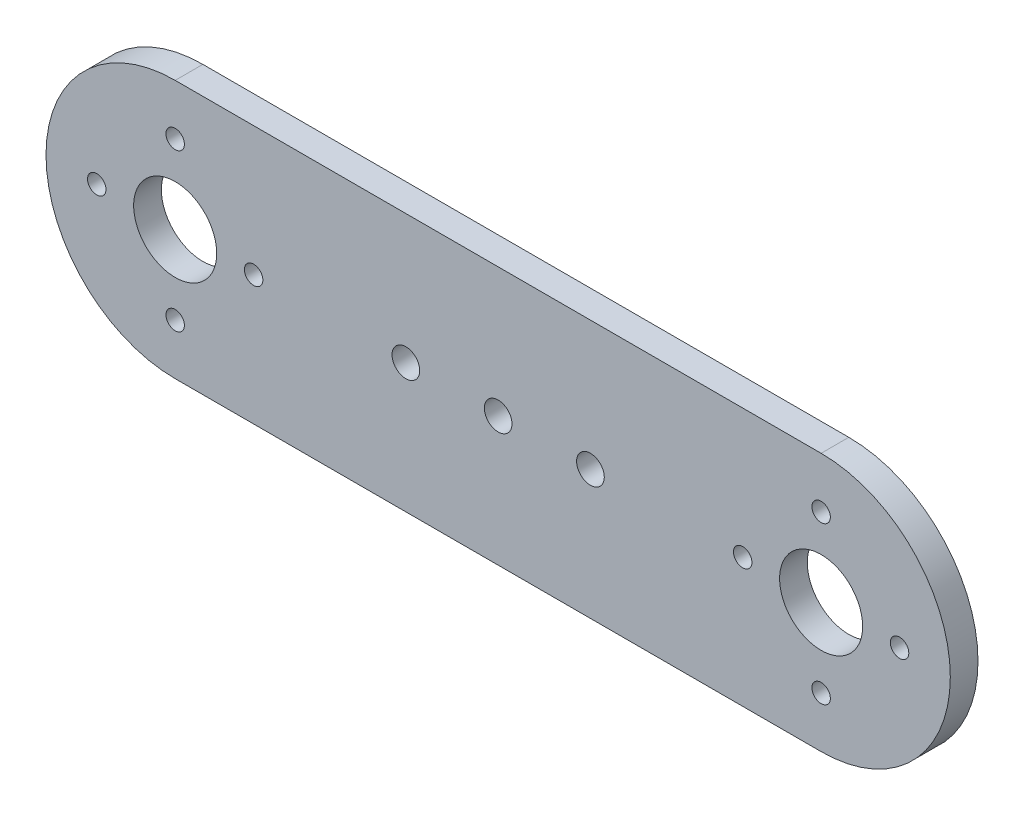
ISO-10303-21;
HEADER;
FILE_DESCRIPTION(('STEP AP214'),'2;1');
FILE_NAME('part.step','',(''),(''),'','','');
FILE_SCHEMA(('AUTOMOTIVE_DESIGN { 1 0 10303 214 1 1 1 1 }'));
ENDSEC;
DATA;
#1=APPLICATION_CONTEXT('core data for automotive mechanical design processes');
#2=APPLICATION_PROTOCOL_DEFINITION('international standard','automotive_design',2000,#1);
#3=PRODUCT_CONTEXT('',#1,'mechanical');
#4=PRODUCT('Part','Part','',(#3));
#5=PRODUCT_RELATED_PRODUCT_CATEGORY('part','',(#4));
#6=PRODUCT_DEFINITION_FORMATION('','',#4);
#7=PRODUCT_DEFINITION_CONTEXT('part definition',#1,'design');
#8=PRODUCT_DEFINITION('design','',#6,#7);
#9=PRODUCT_DEFINITION_SHAPE('','',#8);
#10=(LENGTH_UNIT() NAMED_UNIT(*) SI_UNIT(.MILLI.,.METRE.));
#11=(NAMED_UNIT(*) PLANE_ANGLE_UNIT() SI_UNIT($,.RADIAN.));
#12=(NAMED_UNIT(*) SI_UNIT($,.STERADIAN.) SOLID_ANGLE_UNIT());
#13=UNCERTAINTY_MEASURE_WITH_UNIT(LENGTH_MEASURE(1.E-05),#10,'distance_accuracy_value','');
#14=(GEOMETRIC_REPRESENTATION_CONTEXT(3) GLOBAL_UNCERTAINTY_ASSIGNED_CONTEXT((#13)) GLOBAL_UNIT_ASSIGNED_CONTEXT((#10,
#11,#12)) REPRESENTATION_CONTEXT('',''));
#15=CARTESIAN_POINT('',(0.,0.,0.));
#16=DIRECTION('',(0.,0.,1.));
#17=DIRECTION('',(1.,0.,0.));
#18=AXIS2_PLACEMENT_3D('',#15,#16,#17);
#19=CARTESIAN_POINT('',(0.,0.,3.));
#20=DIRECTION('',(0.,0.,1.));
#21=DIRECTION('',(1.,0.,0.));
#22=AXIS2_PLACEMENT_3D('',#19,#20,#21);
#23=PLANE('',#22);
#24=CARTESIAN_POINT('',(34.9999999999983,0.,3.));
#25=DIRECTION('',(0.,0.,1.));
#26=DIRECTION('',(1.,0.,0.));
#27=AXIS2_PLACEMENT_3D('',#24,#25,#26);
#28=CIRCLE('',#27,1.5);
#29=CARTESIAN_POINT('',(36.4999999999983,0.,3.));
#30=VERTEX_POINT('',#29);
#31=EDGE_CURVE('E180',#30,#30,#28,.T.);
#32=ORIENTED_EDGE('',*,*,#31,.F.);
#33=EDGE_LOOP('',(#32));
#34=FACE_BOUND('',#33,.T.);
#35=CARTESIAN_POINT('',(61.5,0.,3.));
#36=DIRECTION('',(0.,0.,1.));
#37=DIRECTION('',(1.,0.,0.));
#38=AXIS2_PLACEMENT_3D('',#35,#36,#37);
#39=CIRCLE('',#38,0.999999999999998);
#40=CARTESIAN_POINT('',(62.5,0.,3.));
#41=VERTEX_POINT('',#40);
#42=EDGE_CURVE('E168',#41,#41,#39,.T.);
#43=ORIENTED_EDGE('',*,*,#42,.F.);
#44=EDGE_LOOP('',(#43));
#45=FACE_BOUND('',#44,.T.);
#46=CARTESIAN_POINT('',(78.5,0.,3.));
#47=DIRECTION('',(0.,0.,1.));
#48=DIRECTION('',(1.,0.,0.));
#49=AXIS2_PLACEMENT_3D('',#46,#47,#48);
#50=CIRCLE('',#49,0.999999999999998);
#51=CARTESIAN_POINT('',(79.5,0.,3.));
#52=VERTEX_POINT('',#51);
#53=EDGE_CURVE('E156',#52,#52,#50,.T.);
#54=ORIENTED_EDGE('',*,*,#53,.F.);
#55=EDGE_LOOP('',(#54));
#56=FACE_BOUND('',#55,.T.);
#57=CARTESIAN_POINT('',(70.,0.,3.));
#58=DIRECTION('',(0.,0.,1.));
#59=DIRECTION('',(1.,0.,0.));
#60=AXIS2_PLACEMENT_3D('',#57,#58,#59);
#61=CIRCLE('',#60,4.5);
#62=CARTESIAN_POINT('',(74.5,0.,3.));
#63=VERTEX_POINT('',#62);
#64=EDGE_CURVE('E144',#63,#63,#61,.T.);
#65=ORIENTED_EDGE('',*,*,#64,.F.);
#66=EDGE_LOOP('',(#65));
#67=FACE_BOUND('',#66,.T.);
#68=CARTESIAN_POINT('',(0.,-8.5,3.));
#69=DIRECTION('',(0.,0.,1.));
#70=DIRECTION('',(1.,0.,0.));
#71=AXIS2_PLACEMENT_3D('',#68,#69,#70);
#72=CIRCLE('',#71,1.);
#73=CARTESIAN_POINT('',(1.,-8.5,3.));
#74=VERTEX_POINT('',#73);
#75=EDGE_CURVE('E132',#74,#74,#72,.T.);
#76=ORIENTED_EDGE('',*,*,#75,.F.);
#77=EDGE_LOOP('',(#76));
#78=FACE_BOUND('',#77,.T.);
#79=CARTESIAN_POINT('',(0.,8.5,3.));
#80=DIRECTION('',(0.,0.,1.));
#81=DIRECTION('',(1.,0.,0.));
#82=AXIS2_PLACEMENT_3D('',#79,#80,#81);
#83=CIRCLE('',#82,1.);
#84=CARTESIAN_POINT('',(1.,8.5,3.));
#85=VERTEX_POINT('',#84);
#86=EDGE_CURVE('E120',#85,#85,#83,.T.);
#87=ORIENTED_EDGE('',*,*,#86,.F.);
#88=EDGE_LOOP('',(#87));
#89=FACE_BOUND('',#88,.T.);
#90=CARTESIAN_POINT('',(0.,0.,3.));
#91=DIRECTION('',(0.,0.,1.));
#92=DIRECTION('',(1.,0.,0.));
#93=AXIS2_PLACEMENT_3D('',#90,#91,#92);
#94=CIRCLE('',#93,14.);
#95=CARTESIAN_POINT('',(0.,14.,3.));
#96=VERTEX_POINT('',#95);
#97=CARTESIAN_POINT('',(0.,-14.,3.));
#98=VERTEX_POINT('',#97);
#99=EDGE_CURVE('E90',#96,#98,#94,.T.);
#100=ORIENTED_EDGE('',*,*,#99,.T.);
#101=DIRECTION('',(1.,0.,0.));
#102=VECTOR('',#101,1.);
#103=CARTESIAN_POINT('',(0.,-14.,3.));
#104=LINE('',#103,#102);
#105=CARTESIAN_POINT('',(70.,-14.,3.));
#106=VERTEX_POINT('',#105);
#107=EDGE_CURVE('E85',#98,#106,#104,.T.);
#108=ORIENTED_EDGE('',*,*,#107,.T.);
#109=CARTESIAN_POINT('',(70.,0.,3.));
#110=DIRECTION('',(0.,0.,1.));
#111=DIRECTION('',(1.,0.,0.));
#112=AXIS2_PLACEMENT_3D('',#109,#110,#111);
#113=CIRCLE('',#112,14.);
#114=CARTESIAN_POINT('',(70.,14.,3.));
#115=VERTEX_POINT('',#114);
#116=EDGE_CURVE('E88',#106,#115,#113,.T.);
#117=ORIENTED_EDGE('',*,*,#116,.T.);
#118=DIRECTION('',(-1.,0.,0.));
#119=VECTOR('',#118,1.);
#120=CARTESIAN_POINT('',(0.,14.,3.));
#121=LINE('',#120,#119);
#122=EDGE_CURVE('E55',#115,#96,#121,.T.);
#123=ORIENTED_EDGE('',*,*,#122,.T.);
#124=EDGE_LOOP('',(#100,#108,#117,#123));
#125=FACE_BOUND('',#124,.T.);
#126=CARTESIAN_POINT('',(0.,0.,3.));
#127=DIRECTION('',(0.,0.,1.));
#128=DIRECTION('',(1.,0.,0.));
#129=AXIS2_PLACEMENT_3D('',#126,#127,#128);
#130=CIRCLE('',#129,4.5);
#131=CARTESIAN_POINT('',(4.5,0.,3.));
#132=VERTEX_POINT('',#131);
#133=EDGE_CURVE('E105',#132,#132,#130,.T.);
#134=ORIENTED_EDGE('',*,*,#133,.F.);
#135=EDGE_LOOP('',(#134));
#136=FACE_BOUND('',#135,.T.);
#137=CARTESIAN_POINT('',(8.5,0.,3.));
#138=DIRECTION('',(0.,0.,1.));
#139=DIRECTION('',(1.,0.,0.));
#140=AXIS2_PLACEMENT_3D('',#137,#138,#139);
#141=CIRCLE('',#140,1.);
#142=CARTESIAN_POINT('',(9.5,0.,3.));
#143=VERTEX_POINT('',#142);
#144=EDGE_CURVE('E126',#143,#143,#141,.T.);
#145=ORIENTED_EDGE('',*,*,#144,.F.);
#146=EDGE_LOOP('',(#145));
#147=FACE_BOUND('',#146,.T.);
#148=CARTESIAN_POINT('',(-8.5,0.,3.));
#149=DIRECTION('',(0.,0.,1.));
#150=DIRECTION('',(1.,0.,0.));
#151=AXIS2_PLACEMENT_3D('',#148,#149,#150);
#152=CIRCLE('',#151,1.);
#153=CARTESIAN_POINT('',(-7.5,0.,3.));
#154=VERTEX_POINT('',#153);
#155=EDGE_CURVE('E138',#154,#154,#152,.T.);
#156=ORIENTED_EDGE('',*,*,#155,.F.);
#157=EDGE_LOOP('',(#156));
#158=FACE_BOUND('',#157,.T.);
#159=CARTESIAN_POINT('',(70.,8.5,3.));
#160=DIRECTION('',(0.,0.,1.));
#161=DIRECTION('',(1.,0.,0.));
#162=AXIS2_PLACEMENT_3D('',#159,#160,#161);
#163=CIRCLE('',#162,0.999999999999998);
#164=CARTESIAN_POINT('',(71.,8.5,3.));
#165=VERTEX_POINT('',#164);
#166=EDGE_CURVE('E150',#165,#165,#163,.T.);
#167=ORIENTED_EDGE('',*,*,#166,.F.);
#168=EDGE_LOOP('',(#167));
#169=FACE_BOUND('',#168,.T.);
#170=CARTESIAN_POINT('',(70.,-8.5,3.));
#171=DIRECTION('',(0.,0.,1.));
#172=DIRECTION('',(1.,0.,0.));
#173=AXIS2_PLACEMENT_3D('',#170,#171,#172);
#174=CIRCLE('',#173,0.999999999999998);
#175=CARTESIAN_POINT('',(71.,-8.5,3.));
#176=VERTEX_POINT('',#175);
#177=EDGE_CURVE('E162',#176,#176,#174,.T.);
#178=ORIENTED_EDGE('',*,*,#177,.F.);
#179=EDGE_LOOP('',(#178));
#180=FACE_BOUND('',#179,.T.);
#181=CARTESIAN_POINT('',(25.0000000000028,0.,3.));
#182=DIRECTION('',(0.,0.,1.));
#183=DIRECTION('',(1.,0.,0.));
#184=AXIS2_PLACEMENT_3D('',#181,#182,#183);
#185=CIRCLE('',#184,1.5);
#186=CARTESIAN_POINT('',(26.5000000000028,0.,3.));
#187=VERTEX_POINT('',#186);
#188=EDGE_CURVE('E174',#187,#187,#185,.T.);
#189=ORIENTED_EDGE('',*,*,#188,.F.);
#190=EDGE_LOOP('',(#189));
#191=FACE_BOUND('',#190,.T.);
#192=CARTESIAN_POINT('',(44.9999999999938,0.,3.));
#193=DIRECTION('',(0.,0.,1.));
#194=DIRECTION('',(1.,0.,0.));
#195=AXIS2_PLACEMENT_3D('',#192,#193,#194);
#196=CIRCLE('',#195,1.5);
#197=CARTESIAN_POINT('',(46.4999999999938,0.,3.));
#198=VERTEX_POINT('',#197);
#199=EDGE_CURVE('E186',#198,#198,#196,.T.);
#200=ORIENTED_EDGE('',*,*,#199,.F.);
#201=EDGE_LOOP('',(#200));
#202=FACE_BOUND('',#201,.T.);
#203=ADVANCED_FACE('F38',(#34,#45,#56,#67,#78,#89,#125,#136,#147,#158,#169,#180,#191,#202),#23,.T.);
#204=CARTESIAN_POINT('',(0.,0.,0.));
#205=DIRECTION('',(0.,0.,1.));
#206=DIRECTION('',(1.,0.,0.));
#207=AXIS2_PLACEMENT_3D('',#204,#205,#206);
#208=PLANE('',#207);
#209=CARTESIAN_POINT('',(34.9999999999983,0.,0.));
#210=DIRECTION('',(0.,0.,1.));
#211=DIRECTION('',(1.,0.,0.));
#212=AXIS2_PLACEMENT_3D('',#209,#210,#211);
#213=CIRCLE('',#212,1.5);
#214=CARTESIAN_POINT('',(36.4999999999983,0.,0.));
#215=VERTEX_POINT('',#214);
#216=EDGE_CURVE('E183',#215,#215,#213,.T.);
#217=ORIENTED_EDGE('',*,*,#216,.T.);
#218=EDGE_LOOP('',(#217));
#219=FACE_BOUND('',#218,.T.);
#220=CARTESIAN_POINT('',(61.5,0.,0.));
#221=DIRECTION('',(0.,0.,1.));
#222=DIRECTION('',(1.,0.,0.));
#223=AXIS2_PLACEMENT_3D('',#220,#221,#222);
#224=CIRCLE('',#223,0.999999999999998);
#225=CARTESIAN_POINT('',(62.5,0.,0.));
#226=VERTEX_POINT('',#225);
#227=EDGE_CURVE('E171',#226,#226,#224,.T.);
#228=ORIENTED_EDGE('',*,*,#227,.T.);
#229=EDGE_LOOP('',(#228));
#230=FACE_BOUND('',#229,.T.);
#231=CARTESIAN_POINT('',(78.5,0.,0.));
#232=DIRECTION('',(0.,0.,1.));
#233=DIRECTION('',(1.,0.,0.));
#234=AXIS2_PLACEMENT_3D('',#231,#232,#233);
#235=CIRCLE('',#234,0.999999999999998);
#236=CARTESIAN_POINT('',(79.5,0.,0.));
#237=VERTEX_POINT('',#236);
#238=EDGE_CURVE('E159',#237,#237,#235,.T.);
#239=ORIENTED_EDGE('',*,*,#238,.T.);
#240=EDGE_LOOP('',(#239));
#241=FACE_BOUND('',#240,.T.);
#242=CARTESIAN_POINT('',(70.,0.,0.));
#243=DIRECTION('',(0.,0.,1.));
#244=DIRECTION('',(1.,0.,0.));
#245=AXIS2_PLACEMENT_3D('',#242,#243,#244);
#246=CIRCLE('',#245,4.5);
#247=CARTESIAN_POINT('',(74.5,0.,0.));
#248=VERTEX_POINT('',#247);
#249=EDGE_CURVE('E147',#248,#248,#246,.T.);
#250=ORIENTED_EDGE('',*,*,#249,.T.);
#251=EDGE_LOOP('',(#250));
#252=FACE_BOUND('',#251,.T.);
#253=CARTESIAN_POINT('',(0.,-8.5,0.));
#254=DIRECTION('',(0.,0.,1.));
#255=DIRECTION('',(1.,0.,0.));
#256=AXIS2_PLACEMENT_3D('',#253,#254,#255);
#257=CIRCLE('',#256,1.);
#258=CARTESIAN_POINT('',(1.,-8.5,0.));
#259=VERTEX_POINT('',#258);
#260=EDGE_CURVE('E135',#259,#259,#257,.T.);
#261=ORIENTED_EDGE('',*,*,#260,.T.);
#262=EDGE_LOOP('',(#261));
#263=FACE_BOUND('',#262,.T.);
#264=CARTESIAN_POINT('',(0.,8.5,0.));
#265=DIRECTION('',(0.,0.,1.));
#266=DIRECTION('',(1.,0.,0.));
#267=AXIS2_PLACEMENT_3D('',#264,#265,#266);
#268=CIRCLE('',#267,1.);
#269=CARTESIAN_POINT('',(1.,8.5,0.));
#270=VERTEX_POINT('',#269);
#271=EDGE_CURVE('E123',#270,#270,#268,.T.);
#272=ORIENTED_EDGE('',*,*,#271,.T.);
#273=EDGE_LOOP('',(#272));
#274=FACE_BOUND('',#273,.T.);
#275=CARTESIAN_POINT('',(0.,0.,0.));
#276=DIRECTION('',(0.,0.,1.));
#277=DIRECTION('',(1.,0.,0.));
#278=AXIS2_PLACEMENT_3D('',#275,#276,#277);
#279=CIRCLE('',#278,14.);
#280=CARTESIAN_POINT('',(0.,14.,0.));
#281=VERTEX_POINT('',#280);
#282=CARTESIAN_POINT('',(0.,-14.,0.));
#283=VERTEX_POINT('',#282);
#284=EDGE_CURVE('E102',#281,#283,#279,.T.);
#285=ORIENTED_EDGE('',*,*,#284,.F.);
#286=DIRECTION('',(-1.,0.,0.));
#287=VECTOR('',#286,1.);
#288=CARTESIAN_POINT('',(0.,14.,0.));
#289=LINE('',#288,#287);
#290=CARTESIAN_POINT('',(70.,14.,0.));
#291=VERTEX_POINT('',#290);
#292=EDGE_CURVE('E78',#291,#281,#289,.T.);
#293=ORIENTED_EDGE('',*,*,#292,.F.);
#294=CARTESIAN_POINT('',(70.,0.,0.));
#295=DIRECTION('',(0.,0.,1.));
#296=DIRECTION('',(1.,0.,0.));
#297=AXIS2_PLACEMENT_3D('',#294,#295,#296);
#298=CIRCLE('',#297,14.);
#299=CARTESIAN_POINT('',(70.,-14.,0.));
#300=VERTEX_POINT('',#299);
#301=EDGE_CURVE('E72',#300,#291,#298,.T.);
#302=ORIENTED_EDGE('',*,*,#301,.F.);
#303=DIRECTION('',(1.,0.,0.));
#304=VECTOR('',#303,1.);
#305=CARTESIAN_POINT('',(0.,-14.,0.));
#306=LINE('',#305,#304);
#307=EDGE_CURVE('E94',#283,#300,#306,.T.);
#308=ORIENTED_EDGE('',*,*,#307,.F.);
#309=EDGE_LOOP('',(#285,#293,#302,#308));
#310=FACE_BOUND('',#309,.T.);
#311=CARTESIAN_POINT('',(0.,0.,0.));
#312=DIRECTION('',(0.,0.,1.));
#313=DIRECTION('',(1.,0.,0.));
#314=AXIS2_PLACEMENT_3D('',#311,#312,#313);
#315=CIRCLE('',#314,4.5);
#316=CARTESIAN_POINT('',(4.5,0.,0.));
#317=VERTEX_POINT('',#316);
#318=EDGE_CURVE('E117',#317,#317,#315,.T.);
#319=ORIENTED_EDGE('',*,*,#318,.T.);
#320=EDGE_LOOP('',(#319));
#321=FACE_BOUND('',#320,.T.);
#322=CARTESIAN_POINT('',(8.5,0.,0.));
#323=DIRECTION('',(0.,0.,1.));
#324=DIRECTION('',(1.,0.,0.));
#325=AXIS2_PLACEMENT_3D('',#322,#323,#324);
#326=CIRCLE('',#325,1.);
#327=CARTESIAN_POINT('',(9.5,0.,0.));
#328=VERTEX_POINT('',#327);
#329=EDGE_CURVE('E129',#328,#328,#326,.T.);
#330=ORIENTED_EDGE('',*,*,#329,.T.);
#331=EDGE_LOOP('',(#330));
#332=FACE_BOUND('',#331,.T.);
#333=CARTESIAN_POINT('',(-8.5,0.,0.));
#334=DIRECTION('',(0.,0.,1.));
#335=DIRECTION('',(1.,0.,0.));
#336=AXIS2_PLACEMENT_3D('',#333,#334,#335);
#337=CIRCLE('',#336,1.);
#338=CARTESIAN_POINT('',(-7.5,0.,0.));
#339=VERTEX_POINT('',#338);
#340=EDGE_CURVE('E141',#339,#339,#337,.T.);
#341=ORIENTED_EDGE('',*,*,#340,.T.);
#342=EDGE_LOOP('',(#341));
#343=FACE_BOUND('',#342,.T.);
#344=CARTESIAN_POINT('',(70.,8.5,0.));
#345=DIRECTION('',(0.,0.,1.));
#346=DIRECTION('',(1.,0.,0.));
#347=AXIS2_PLACEMENT_3D('',#344,#345,#346);
#348=CIRCLE('',#347,0.999999999999998);
#349=CARTESIAN_POINT('',(71.,8.5,0.));
#350=VERTEX_POINT('',#349);
#351=EDGE_CURVE('E153',#350,#350,#348,.T.);
#352=ORIENTED_EDGE('',*,*,#351,.T.);
#353=EDGE_LOOP('',(#352));
#354=FACE_BOUND('',#353,.T.);
#355=CARTESIAN_POINT('',(70.,-8.5,0.));
#356=DIRECTION('',(0.,0.,1.));
#357=DIRECTION('',(1.,0.,0.));
#358=AXIS2_PLACEMENT_3D('',#355,#356,#357);
#359=CIRCLE('',#358,0.999999999999998);
#360=CARTESIAN_POINT('',(71.,-8.5,0.));
#361=VERTEX_POINT('',#360);
#362=EDGE_CURVE('E165',#361,#361,#359,.T.);
#363=ORIENTED_EDGE('',*,*,#362,.T.);
#364=EDGE_LOOP('',(#363));
#365=FACE_BOUND('',#364,.T.);
#366=CARTESIAN_POINT('',(25.0000000000028,0.,0.));
#367=DIRECTION('',(0.,0.,1.));
#368=DIRECTION('',(1.,0.,0.));
#369=AXIS2_PLACEMENT_3D('',#366,#367,#368);
#370=CIRCLE('',#369,1.5);
#371=CARTESIAN_POINT('',(26.5000000000028,0.,0.));
#372=VERTEX_POINT('',#371);
#373=EDGE_CURVE('E177',#372,#372,#370,.T.);
#374=ORIENTED_EDGE('',*,*,#373,.T.);
#375=EDGE_LOOP('',(#374));
#376=FACE_BOUND('',#375,.T.);
#377=CARTESIAN_POINT('',(44.9999999999938,0.,0.));
#378=DIRECTION('',(0.,0.,1.));
#379=DIRECTION('',(1.,0.,0.));
#380=AXIS2_PLACEMENT_3D('',#377,#378,#379);
#381=CIRCLE('',#380,1.5);
#382=CARTESIAN_POINT('',(46.4999999999938,0.,0.));
#383=VERTEX_POINT('',#382);
#384=EDGE_CURVE('E189',#383,#383,#381,.T.);
#385=ORIENTED_EDGE('',*,*,#384,.T.);
#386=EDGE_LOOP('',(#385));
#387=FACE_BOUND('',#386,.T.);
#388=ADVANCED_FACE('F113',(#219,#230,#241,#252,#263,#274,#310,#321,#332,#343,#354,#365,#376,
#387),#208,.F.);
#389=CARTESIAN_POINT('',(0.,0.,3.));
#390=DIRECTION('',(0.,0.,-1.));
#391=DIRECTION('',(-1.,0.,0.));
#392=AXIS2_PLACEMENT_3D('',#389,#390,#391);
#393=CYLINDRICAL_SURFACE('',#392,14.);
#394=ORIENTED_EDGE('',*,*,#284,.T.);
#395=DIRECTION('',(0.,0.,-1.));
#396=VECTOR('',#395,1.);
#397=CARTESIAN_POINT('',(0.,-14.,3.));
#398=LINE('',#397,#396);
#399=EDGE_CURVE('E11',#98,#283,#398,.T.);
#400=ORIENTED_EDGE('',*,*,#399,.F.);
#401=ORIENTED_EDGE('',*,*,#99,.F.);
#402=DIRECTION('',(0.,0.,-1.));
#403=VECTOR('',#402,1.);
#404=CARTESIAN_POINT('',(0.,14.,3.));
#405=LINE('',#404,#403);
#406=EDGE_CURVE('E98',#96,#281,#405,.T.);
#407=ORIENTED_EDGE('',*,*,#406,.T.);
#408=EDGE_LOOP('',(#394,#400,#401,#407));
#409=FACE_BOUND('',#408,.T.);
#410=ADVANCED_FACE('F40',(#409),#393,.T.);
#411=CARTESIAN_POINT('',(0.,-14.,3.));
#412=DIRECTION('',(0.,1.,0.));
#413=DIRECTION('',(0.,0.,1.));
#414=AXIS2_PLACEMENT_3D('',#411,#412,#413);
#415=PLANE('',#414);
#416=ORIENTED_EDGE('',*,*,#307,.T.);
#417=DIRECTION('',(0.,0.,-1.));
#418=VECTOR('',#417,1.);
#419=CARTESIAN_POINT('',(70.,-14.,3.));
#420=LINE('',#419,#418);
#421=EDGE_CURVE('E47',#106,#300,#420,.T.);
#422=ORIENTED_EDGE('',*,*,#421,.F.);
#423=ORIENTED_EDGE('',*,*,#107,.F.);
#424=ORIENTED_EDGE('',*,*,#399,.T.);
#425=EDGE_LOOP('',(#416,#422,#423,#424));
#426=FACE_BOUND('',#425,.T.);
#427=ADVANCED_FACE('F93',(#426),#415,.F.);
#428=CARTESIAN_POINT('',(70.,0.,3.));
#429=DIRECTION('',(0.,0.,-1.));
#430=DIRECTION('',(-1.,0.,0.));
#431=AXIS2_PLACEMENT_3D('',#428,#429,#430);
#432=CYLINDRICAL_SURFACE('',#431,14.);
#433=ORIENTED_EDGE('',*,*,#301,.T.);
#434=DIRECTION('',(0.,0.,-1.));
#435=VECTOR('',#434,1.);
#436=CARTESIAN_POINT('',(70.,14.,3.));
#437=LINE('',#436,#435);
#438=EDGE_CURVE('E95',#115,#291,#437,.T.);
#439=ORIENTED_EDGE('',*,*,#438,.F.);
#440=ORIENTED_EDGE('',*,*,#116,.F.);
#441=ORIENTED_EDGE('',*,*,#421,.T.);
#442=EDGE_LOOP('',(#433,#439,#440,#441));
#443=FACE_BOUND('',#442,.T.);
#444=ADVANCED_FACE('F96',(#443),#432,.T.);
#445=CARTESIAN_POINT('',(0.,14.,3.));
#446=DIRECTION('',(0.,-1.,0.));
#447=DIRECTION('',(0.,0.,-1.));
#448=AXIS2_PLACEMENT_3D('',#445,#446,#447);
#449=PLANE('',#448);
#450=ORIENTED_EDGE('',*,*,#292,.T.);
#451=ORIENTED_EDGE('',*,*,#406,.F.);
#452=ORIENTED_EDGE('',*,*,#122,.F.);
#453=ORIENTED_EDGE('',*,*,#438,.T.);
#454=EDGE_LOOP('',(#450,#451,#452,#453));
#455=FACE_BOUND('',#454,.T.);
#456=ADVANCED_FACE('F110',(#455),#449,.F.);
#457=CARTESIAN_POINT('',(0.,0.,3.));
#458=DIRECTION('',(0.,0.,-1.));
#459=DIRECTION('',(-1.,0.,0.));
#460=AXIS2_PLACEMENT_3D('',#457,#458,#459);
#461=CYLINDRICAL_SURFACE('',#460,4.5);
#462=ORIENTED_EDGE('',*,*,#133,.T.);
#463=EDGE_LOOP('',(#462));
#464=FACE_BOUND('',#463,.T.);
#465=ORIENTED_EDGE('',*,*,#318,.F.);
#466=EDGE_LOOP('',(#465));
#467=FACE_BOUND('',#466,.T.);
#468=ADVANCED_FACE('F208',(#464,#467),#461,.F.);
#469=CARTESIAN_POINT('',(0.,8.5,3.));
#470=DIRECTION('',(0.,0.,-1.));
#471=DIRECTION('',(-1.,0.,0.));
#472=AXIS2_PLACEMENT_3D('',#469,#470,#471);
#473=CYLINDRICAL_SURFACE('',#472,1.);
#474=ORIENTED_EDGE('',*,*,#86,.T.);
#475=EDGE_LOOP('',(#474));
#476=FACE_BOUND('',#475,.T.);
#477=ORIENTED_EDGE('',*,*,#271,.F.);
#478=EDGE_LOOP('',(#477));
#479=FACE_BOUND('',#478,.T.);
#480=ADVANCED_FACE('F256',(#476,#479),#473,.F.);
#481=CARTESIAN_POINT('',(8.5,0.,3.));
#482=DIRECTION('',(0.,0.,-1.));
#483=DIRECTION('',(-1.,0.,0.));
#484=AXIS2_PLACEMENT_3D('',#481,#482,#483);
#485=CYLINDRICAL_SURFACE('',#484,1.);
#486=ORIENTED_EDGE('',*,*,#144,.T.);
#487=EDGE_LOOP('',(#486));
#488=FACE_BOUND('',#487,.T.);
#489=ORIENTED_EDGE('',*,*,#329,.F.);
#490=EDGE_LOOP('',(#489));
#491=FACE_BOUND('',#490,.T.);
#492=ADVANCED_FACE('F264',(#488,#491),#485,.F.);
#493=CARTESIAN_POINT('',(0.,-8.5,3.));
#494=DIRECTION('',(0.,0.,-1.));
#495=DIRECTION('',(-1.,0.,0.));
#496=AXIS2_PLACEMENT_3D('',#493,#494,#495);
#497=CYLINDRICAL_SURFACE('',#496,1.);
#498=ORIENTED_EDGE('',*,*,#75,.T.);
#499=EDGE_LOOP('',(#498));
#500=FACE_BOUND('',#499,.T.);
#501=ORIENTED_EDGE('',*,*,#260,.F.);
#502=EDGE_LOOP('',(#501));
#503=FACE_BOUND('',#502,.T.);
#504=ADVANCED_FACE('F272',(#500,#503),#497,.F.);
#505=CARTESIAN_POINT('',(-8.5,0.,3.));
#506=DIRECTION('',(0.,0.,-1.));
#507=DIRECTION('',(-1.,0.,0.));
#508=AXIS2_PLACEMENT_3D('',#505,#506,#507);
#509=CYLINDRICAL_SURFACE('',#508,1.);
#510=ORIENTED_EDGE('',*,*,#155,.T.);
#511=EDGE_LOOP('',(#510));
#512=FACE_BOUND('',#511,.T.);
#513=ORIENTED_EDGE('',*,*,#340,.F.);
#514=EDGE_LOOP('',(#513));
#515=FACE_BOUND('',#514,.T.);
#516=ADVANCED_FACE('F281',(#512,#515),#509,.F.);
#517=CARTESIAN_POINT('',(70.,0.,3.));
#518=DIRECTION('',(0.,0.,-1.));
#519=DIRECTION('',(-1.,0.,0.));
#520=AXIS2_PLACEMENT_3D('',#517,#518,#519);
#521=CYLINDRICAL_SURFACE('',#520,4.5);
#522=ORIENTED_EDGE('',*,*,#64,.T.);
#523=EDGE_LOOP('',(#522));
#524=FACE_BOUND('',#523,.T.);
#525=ORIENTED_EDGE('',*,*,#249,.F.);
#526=EDGE_LOOP('',(#525));
#527=FACE_BOUND('',#526,.T.);
#528=ADVANCED_FACE('F290',(#524,#527),#521,.F.);
#529=CARTESIAN_POINT('',(70.,8.5,3.));
#530=DIRECTION('',(0.,0.,-1.));
#531=DIRECTION('',(-1.,0.,0.));
#532=AXIS2_PLACEMENT_3D('',#529,#530,#531);
#533=CYLINDRICAL_SURFACE('',#532,0.999999999999998);
#534=ORIENTED_EDGE('',*,*,#166,.T.);
#535=EDGE_LOOP('',(#534));
#536=FACE_BOUND('',#535,.T.);
#537=ORIENTED_EDGE('',*,*,#351,.F.);
#538=EDGE_LOOP('',(#537));
#539=FACE_BOUND('',#538,.T.);
#540=ADVANCED_FACE('F299',(#536,#539),#533,.F.);
#541=CARTESIAN_POINT('',(78.5,0.,3.));
#542=DIRECTION('',(0.,0.,-1.));
#543=DIRECTION('',(-1.,0.,0.));
#544=AXIS2_PLACEMENT_3D('',#541,#542,#543);
#545=CYLINDRICAL_SURFACE('',#544,0.999999999999998);
#546=ORIENTED_EDGE('',*,*,#53,.T.);
#547=EDGE_LOOP('',(#546));
#548=FACE_BOUND('',#547,.T.);
#549=ORIENTED_EDGE('',*,*,#238,.F.);
#550=EDGE_LOOP('',(#549));
#551=FACE_BOUND('',#550,.T.);
#552=ADVANCED_FACE('F308',(#548,#551),#545,.F.);
#553=CARTESIAN_POINT('',(70.,-8.5,3.));
#554=DIRECTION('',(0.,0.,-1.));
#555=DIRECTION('',(-1.,0.,0.));
#556=AXIS2_PLACEMENT_3D('',#553,#554,#555);
#557=CYLINDRICAL_SURFACE('',#556,0.999999999999998);
#558=ORIENTED_EDGE('',*,*,#177,.T.);
#559=EDGE_LOOP('',(#558));
#560=FACE_BOUND('',#559,.T.);
#561=ORIENTED_EDGE('',*,*,#362,.F.);
#562=EDGE_LOOP('',(#561));
#563=FACE_BOUND('',#562,.T.);
#564=ADVANCED_FACE('F317',(#560,#563),#557,.F.);
#565=CARTESIAN_POINT('',(61.5,0.,3.));
#566=DIRECTION('',(0.,0.,-1.));
#567=DIRECTION('',(-1.,0.,0.));
#568=AXIS2_PLACEMENT_3D('',#565,#566,#567);
#569=CYLINDRICAL_SURFACE('',#568,0.999999999999998);
#570=ORIENTED_EDGE('',*,*,#42,.T.);
#571=EDGE_LOOP('',(#570));
#572=FACE_BOUND('',#571,.T.);
#573=ORIENTED_EDGE('',*,*,#227,.F.);
#574=EDGE_LOOP('',(#573));
#575=FACE_BOUND('',#574,.T.);
#576=ADVANCED_FACE('F326',(#572,#575),#569,.F.);
#577=CARTESIAN_POINT('',(25.0000000000028,0.,3.));
#578=DIRECTION('',(0.,0.,-1.));
#579=DIRECTION('',(-1.,0.,0.));
#580=AXIS2_PLACEMENT_3D('',#577,#578,#579);
#581=CYLINDRICAL_SURFACE('',#580,1.5);
#582=ORIENTED_EDGE('',*,*,#188,.T.);
#583=EDGE_LOOP('',(#582));
#584=FACE_BOUND('',#583,.T.);
#585=ORIENTED_EDGE('',*,*,#373,.F.);
#586=EDGE_LOOP('',(#585));
#587=FACE_BOUND('',#586,.T.);
#588=ADVANCED_FACE('F335',(#584,#587),#581,.F.);
#589=CARTESIAN_POINT('',(34.9999999999983,0.,3.));
#590=DIRECTION('',(0.,0.,-1.));
#591=DIRECTION('',(-1.,0.,0.));
#592=AXIS2_PLACEMENT_3D('',#589,#590,#591);
#593=CYLINDRICAL_SURFACE('',#592,1.5);
#594=ORIENTED_EDGE('',*,*,#31,.T.);
#595=EDGE_LOOP('',(#594));
#596=FACE_BOUND('',#595,.T.);
#597=ORIENTED_EDGE('',*,*,#216,.F.);
#598=EDGE_LOOP('',(#597));
#599=FACE_BOUND('',#598,.T.);
#600=ADVANCED_FACE('F344',(#596,#599),#593,.F.);
#601=CARTESIAN_POINT('',(44.9999999999938,0.,3.));
#602=DIRECTION('',(0.,0.,-1.));
#603=DIRECTION('',(-1.,0.,0.));
#604=AXIS2_PLACEMENT_3D('',#601,#602,#603);
#605=CYLINDRICAL_SURFACE('',#604,1.5);
#606=ORIENTED_EDGE('',*,*,#199,.T.);
#607=EDGE_LOOP('',(#606));
#608=FACE_BOUND('',#607,.T.);
#609=ORIENTED_EDGE('',*,*,#384,.F.);
#610=EDGE_LOOP('',(#609));
#611=FACE_BOUND('',#610,.T.);
#612=ADVANCED_FACE('F195',(#608,#611),#605,.F.);
#613=CLOSED_SHELL('',(#203,#388,#410,#427,#444,#456,#468,#480,#492,#504,#516,#528,#540,#552,
#564,#576,#588,#600,#612));
#614=MANIFOLD_SOLID_BREP('B2',#613);
#615=ADVANCED_BREP_SHAPE_REPRESENTATION('',(#18,#614),#14);
#616=SHAPE_DEFINITION_REPRESENTATION(#9,#615);
ENDSEC;
END-ISO-10303-21;
